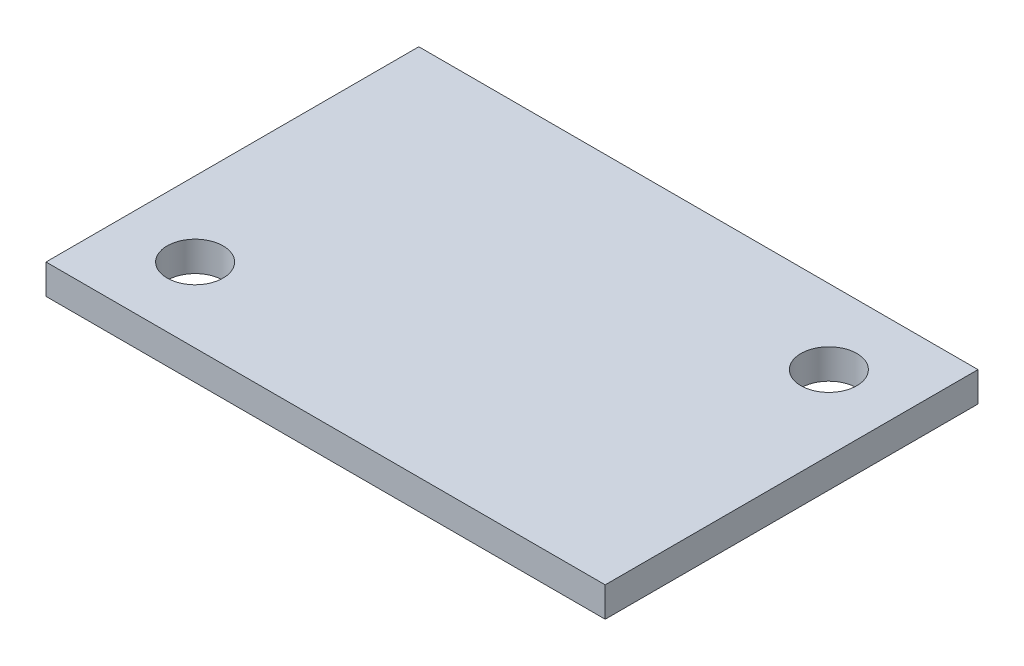
ISO-10303-21;
HEADER;
FILE_DESCRIPTION(('STEP AP214'),'2;1');
FILE_NAME('part.step','',(''),(''),'','','');
FILE_SCHEMA(('AUTOMOTIVE_DESIGN { 1 0 10303 214 1 1 1 1 }'));
ENDSEC;
DATA;
#1=APPLICATION_CONTEXT('core data for automotive mechanical design processes');
#2=APPLICATION_PROTOCOL_DEFINITION('international standard','automotive_design',2000,#1);
#3=PRODUCT_CONTEXT('',#1,'mechanical');
#4=PRODUCT('Part','Part','',(#3));
#5=PRODUCT_RELATED_PRODUCT_CATEGORY('part','',(#4));
#6=PRODUCT_DEFINITION_FORMATION('','',#4);
#7=PRODUCT_DEFINITION_CONTEXT('part definition',#1,'design');
#8=PRODUCT_DEFINITION('design','',#6,#7);
#9=PRODUCT_DEFINITION_SHAPE('','',#8);
#10=(LENGTH_UNIT() NAMED_UNIT(*) SI_UNIT(.MILLI.,.METRE.));
#11=(NAMED_UNIT(*) PLANE_ANGLE_UNIT() SI_UNIT($,.RADIAN.));
#12=(NAMED_UNIT(*) SI_UNIT($,.STERADIAN.) SOLID_ANGLE_UNIT());
#13=UNCERTAINTY_MEASURE_WITH_UNIT(LENGTH_MEASURE(1.E-05),#10,'distance_accuracy_value','');
#14=(GEOMETRIC_REPRESENTATION_CONTEXT(3) GLOBAL_UNCERTAINTY_ASSIGNED_CONTEXT((#13)) GLOBAL_UNIT_ASSIGNED_CONTEXT((#10,
#11,#12)) REPRESENTATION_CONTEXT('',''));
#15=CARTESIAN_POINT('',(0.,0.,0.));
#16=DIRECTION('',(0.,0.,1.));
#17=DIRECTION('',(1.,0.,0.));
#18=AXIS2_PLACEMENT_3D('',#15,#16,#17);
#19=CARTESIAN_POINT('',(0.,1.6,0.));
#20=DIRECTION('',(0.,1.,0.));
#21=DIRECTION('',(0.,0.,1.));
#22=AXIS2_PLACEMENT_3D('',#19,#20,#21);
#23=PLANE('',#22);
#24=CARTESIAN_POINT('',(-11.,1.6,6.));
#25=DIRECTION('',(0.,1.,0.));
#26=DIRECTION('',(0.,0.,1.));
#27=AXIS2_PLACEMENT_3D('',#24,#25,#26);
#28=CIRCLE('',#27,1.5);
#29=CARTESIAN_POINT('',(-11.,1.6,7.5));
#30=VERTEX_POINT('',#29);
#31=EDGE_CURVE('E100',#30,#30,#28,.T.);
#32=ORIENTED_EDGE('',*,*,#31,.F.);
#33=EDGE_LOOP('',(#32));
#34=FACE_BOUND('',#33,.T.);
#35=DIRECTION('',(0.,0.,1.));
#36=VECTOR('',#35,1.);
#37=CARTESIAN_POINT('',(-15.,1.6,10.));
#38=LINE('',#37,#36);
#39=CARTESIAN_POINT('',(-15.,1.6,-10.));
#40=VERTEX_POINT('',#39);
#41=CARTESIAN_POINT('',(-15.,1.6,10.));
#42=VERTEX_POINT('',#41);
#43=EDGE_CURVE('E85',#40,#42,#38,.T.);
#44=ORIENTED_EDGE('',*,*,#43,.T.);
#45=DIRECTION('',(1.,0.,0.));
#46=VECTOR('',#45,1.);
#47=CARTESIAN_POINT('',(15.,1.6,9.99999999999999));
#48=LINE('',#47,#46);
#49=CARTESIAN_POINT('',(15.,1.6,9.99999999999999));
#50=VERTEX_POINT('',#49);
#51=EDGE_CURVE('E80',#42,#50,#48,.T.);
#52=ORIENTED_EDGE('',*,*,#51,.T.);
#53=DIRECTION('',(0.,0.,-1.));
#54=VECTOR('',#53,1.);
#55=CARTESIAN_POINT('',(15.,1.6,9.99999999999999));
#56=LINE('',#55,#54);
#57=CARTESIAN_POINT('',(15.,1.6,-10.));
#58=VERTEX_POINT('',#57);
#59=EDGE_CURVE('E83',#50,#58,#56,.T.);
#60=ORIENTED_EDGE('',*,*,#59,.T.);
#61=DIRECTION('',(-1.,0.,0.));
#62=VECTOR('',#61,1.);
#63=CARTESIAN_POINT('',(15.,1.6,-10.));
#64=LINE('',#63,#62);
#65=EDGE_CURVE('E50',#58,#40,#64,.T.);
#66=ORIENTED_EDGE('',*,*,#65,.T.);
#67=EDGE_LOOP('',(#44,#52,#60,#66));
#68=FACE_BOUND('',#67,.T.);
#69=CARTESIAN_POINT('',(11.,1.6,-6.));
#70=DIRECTION('',(0.,1.,0.));
#71=DIRECTION('',(0.,0.,1.));
#72=AXIS2_PLACEMENT_3D('',#69,#70,#71);
#73=CIRCLE('',#72,1.5);
#74=CARTESIAN_POINT('',(11.,1.6,-4.5));
#75=VERTEX_POINT('',#74);
#76=EDGE_CURVE('E115',#75,#75,#73,.T.);
#77=ORIENTED_EDGE('',*,*,#76,.F.);
#78=EDGE_LOOP('',(#77));
#79=FACE_BOUND('',#78,.T.);
#80=ADVANCED_FACE('F33',(#34,#68,#79),#23,.T.);
#81=CARTESIAN_POINT('',(0.,0.,0.));
#82=DIRECTION('',(0.,1.,0.));
#83=DIRECTION('',(0.,0.,1.));
#84=AXIS2_PLACEMENT_3D('',#81,#82,#83);
#85=PLANE('',#84);
#86=DIRECTION('',(0.,0.,1.));
#87=VECTOR('',#86,1.);
#88=CARTESIAN_POINT('',(-15.,0.,10.));
#89=LINE('',#88,#87);
#90=CARTESIAN_POINT('',(-15.,0.,-10.));
#91=VERTEX_POINT('',#90);
#92=CARTESIAN_POINT('',(-15.,0.,10.));
#93=VERTEX_POINT('',#92);
#94=EDGE_CURVE('E97',#91,#93,#89,.T.);
#95=ORIENTED_EDGE('',*,*,#94,.F.);
#96=DIRECTION('',(-1.,0.,0.));
#97=VECTOR('',#96,1.);
#98=CARTESIAN_POINT('',(15.,0.,-10.));
#99=LINE('',#98,#97);
#100=CARTESIAN_POINT('',(15.,0.,-10.));
#101=VERTEX_POINT('',#100);
#102=EDGE_CURVE('E73',#101,#91,#99,.T.);
#103=ORIENTED_EDGE('',*,*,#102,.F.);
#104=DIRECTION('',(0.,0.,-1.));
#105=VECTOR('',#104,1.);
#106=CARTESIAN_POINT('',(15.,0.,9.99999999999999));
#107=LINE('',#106,#105);
#108=CARTESIAN_POINT('',(15.,0.,9.99999999999999));
#109=VERTEX_POINT('',#108);
#110=EDGE_CURVE('E67',#109,#101,#107,.T.);
#111=ORIENTED_EDGE('',*,*,#110,.F.);
#112=DIRECTION('',(1.,0.,0.));
#113=VECTOR('',#112,1.);
#114=CARTESIAN_POINT('',(15.,0.,9.99999999999999));
#115=LINE('',#114,#113);
#116=EDGE_CURVE('E89',#93,#109,#115,.T.);
#117=ORIENTED_EDGE('',*,*,#116,.F.);
#118=EDGE_LOOP('',(#95,#103,#111,#117));
#119=FACE_BOUND('',#118,.T.);
#120=CARTESIAN_POINT('',(-11.,0.,6.));
#121=DIRECTION('',(0.,1.,0.));
#122=DIRECTION('',(0.,0.,1.));
#123=AXIS2_PLACEMENT_3D('',#120,#121,#122);
#124=CIRCLE('',#123,1.5);
#125=CARTESIAN_POINT('',(-11.,0.,7.5));
#126=VERTEX_POINT('',#125);
#127=EDGE_CURVE('E112',#126,#126,#124,.T.);
#128=ORIENTED_EDGE('',*,*,#127,.T.);
#129=EDGE_LOOP('',(#128));
#130=FACE_BOUND('',#129,.T.);
#131=CARTESIAN_POINT('',(11.,0.,-6.));
#132=DIRECTION('',(0.,1.,0.));
#133=DIRECTION('',(0.,0.,1.));
#134=AXIS2_PLACEMENT_3D('',#131,#132,#133);
#135=CIRCLE('',#134,1.5);
#136=CARTESIAN_POINT('',(11.,0.,-4.5));
#137=VERTEX_POINT('',#136);
#138=EDGE_CURVE('E118',#137,#137,#135,.T.);
#139=ORIENTED_EDGE('',*,*,#138,.T.);
#140=EDGE_LOOP('',(#139));
#141=FACE_BOUND('',#140,.T.);
#142=ADVANCED_FACE('F108',(#119,#130,#141),#85,.F.);
#143=CARTESIAN_POINT('',(-15.,1.6,10.));
#144=DIRECTION('',(1.,0.,0.));
#145=DIRECTION('',(0.,0.,-1.));
#146=AXIS2_PLACEMENT_3D('',#143,#144,#145);
#147=PLANE('',#146);
#148=ORIENTED_EDGE('',*,*,#94,.T.);
#149=DIRECTION('',(0.,-1.,0.));
#150=VECTOR('',#149,1.);
#151=CARTESIAN_POINT('',(-15.,1.6,10.));
#152=LINE('',#151,#150);
#153=EDGE_CURVE('E11',#42,#93,#152,.T.);
#154=ORIENTED_EDGE('',*,*,#153,.F.);
#155=ORIENTED_EDGE('',*,*,#43,.F.);
#156=DIRECTION('',(0.,-1.,0.));
#157=VECTOR('',#156,1.);
#158=CARTESIAN_POINT('',(-15.,1.6,-10.));
#159=LINE('',#158,#157);
#160=EDGE_CURVE('E93',#40,#91,#159,.T.);
#161=ORIENTED_EDGE('',*,*,#160,.T.);
#162=EDGE_LOOP('',(#148,#154,#155,#161));
#163=FACE_BOUND('',#162,.T.);
#164=ADVANCED_FACE('F35',(#163),#147,.F.);
#165=CARTESIAN_POINT('',(15.,1.6,9.99999999999999));
#166=DIRECTION('',(0.,0.,-1.));
#167=DIRECTION('',(-1.,0.,0.));
#168=AXIS2_PLACEMENT_3D('',#165,#166,#167);
#169=PLANE('',#168);
#170=ORIENTED_EDGE('',*,*,#116,.T.);
#171=DIRECTION('',(0.,-1.,0.));
#172=VECTOR('',#171,1.);
#173=CARTESIAN_POINT('',(15.,1.6,9.99999999999999));
#174=LINE('',#173,#172);
#175=EDGE_CURVE('E42',#50,#109,#174,.T.);
#176=ORIENTED_EDGE('',*,*,#175,.F.);
#177=ORIENTED_EDGE('',*,*,#51,.F.);
#178=ORIENTED_EDGE('',*,*,#153,.T.);
#179=EDGE_LOOP('',(#170,#176,#177,#178));
#180=FACE_BOUND('',#179,.T.);
#181=ADVANCED_FACE('F88',(#180),#169,.F.);
#182=CARTESIAN_POINT('',(15.,1.6,9.99999999999999));
#183=DIRECTION('',(-1.,0.,0.));
#184=DIRECTION('',(0.,0.,1.));
#185=AXIS2_PLACEMENT_3D('',#182,#183,#184);
#186=PLANE('',#185);
#187=ORIENTED_EDGE('',*,*,#110,.T.);
#188=DIRECTION('',(0.,-1.,0.));
#189=VECTOR('',#188,1.);
#190=CARTESIAN_POINT('',(15.,1.6,-10.));
#191=LINE('',#190,#189);
#192=EDGE_CURVE('E90',#58,#101,#191,.T.);
#193=ORIENTED_EDGE('',*,*,#192,.F.);
#194=ORIENTED_EDGE('',*,*,#59,.F.);
#195=ORIENTED_EDGE('',*,*,#175,.T.);
#196=EDGE_LOOP('',(#187,#193,#194,#195));
#197=FACE_BOUND('',#196,.T.);
#198=ADVANCED_FACE('F91',(#197),#186,.F.);
#199=CARTESIAN_POINT('',(15.,1.6,-10.));
#200=DIRECTION('',(0.,0.,1.));
#201=DIRECTION('',(1.,0.,0.));
#202=AXIS2_PLACEMENT_3D('',#199,#200,#201);
#203=PLANE('',#202);
#204=ORIENTED_EDGE('',*,*,#102,.T.);
#205=ORIENTED_EDGE('',*,*,#160,.F.);
#206=ORIENTED_EDGE('',*,*,#65,.F.);
#207=ORIENTED_EDGE('',*,*,#192,.T.);
#208=EDGE_LOOP('',(#204,#205,#206,#207));
#209=FACE_BOUND('',#208,.T.);
#210=ADVANCED_FACE('F105',(#209),#203,.F.);
#211=CARTESIAN_POINT('',(-11.,1.6,6.));
#212=DIRECTION('',(0.,-1.,0.));
#213=DIRECTION('',(0.,0.,-1.));
#214=AXIS2_PLACEMENT_3D('',#211,#212,#213);
#215=CYLINDRICAL_SURFACE('',#214,1.5);
#216=ORIENTED_EDGE('',*,*,#31,.T.);
#217=EDGE_LOOP('',(#216));
#218=FACE_BOUND('',#217,.T.);
#219=ORIENTED_EDGE('',*,*,#127,.F.);
#220=EDGE_LOOP('',(#219));
#221=FACE_BOUND('',#220,.T.);
#222=ADVANCED_FACE('F135',(#218,#221),#215,.F.);
#223=CARTESIAN_POINT('',(11.,1.6,-6.));
#224=DIRECTION('',(0.,-1.,0.));
#225=DIRECTION('',(0.,0.,-1.));
#226=AXIS2_PLACEMENT_3D('',#223,#224,#225);
#227=CYLINDRICAL_SURFACE('',#226,1.5);
#228=ORIENTED_EDGE('',*,*,#76,.T.);
#229=EDGE_LOOP('',(#228));
#230=FACE_BOUND('',#229,.T.);
#231=ORIENTED_EDGE('',*,*,#138,.F.);
#232=EDGE_LOOP('',(#231));
#233=FACE_BOUND('',#232,.T.);
#234=ADVANCED_FACE('F124',(#230,#233),#227,.F.);
#235=CLOSED_SHELL('',(#80,#142,#164,#181,#198,#210,#222,#234));
#236=MANIFOLD_SOLID_BREP('B2',#235);
#237=ADVANCED_BREP_SHAPE_REPRESENTATION('',(#18,#236),#14);
#238=SHAPE_DEFINITION_REPRESENTATION(#9,#237);
ENDSEC;
END-ISO-10303-21;
